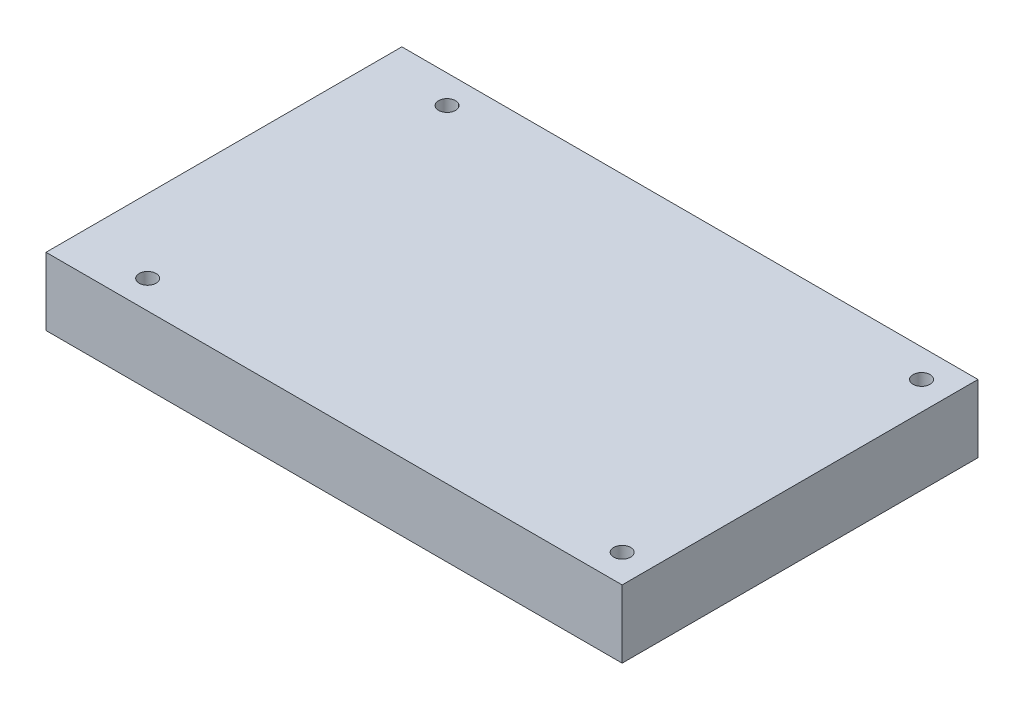
ISO-10303-21;
HEADER;
FILE_DESCRIPTION(('STEP AP214'),'2;1');
FILE_NAME('part.step','',(''),(''),'','','');
FILE_SCHEMA(('AUTOMOTIVE_DESIGN { 1 0 10303 214 1 1 1 1 }'));
ENDSEC;
DATA;
#1=APPLICATION_CONTEXT('core data for automotive mechanical design processes');
#2=APPLICATION_PROTOCOL_DEFINITION('international standard','automotive_design',2000,#1);
#3=PRODUCT_CONTEXT('',#1,'mechanical');
#4=PRODUCT('Part','Part','',(#3));
#5=PRODUCT_RELATED_PRODUCT_CATEGORY('part','',(#4));
#6=PRODUCT_DEFINITION_FORMATION('','',#4);
#7=PRODUCT_DEFINITION_CONTEXT('part definition',#1,'design');
#8=PRODUCT_DEFINITION('design','',#6,#7);
#9=PRODUCT_DEFINITION_SHAPE('','',#8);
#10=(LENGTH_UNIT() NAMED_UNIT(*) SI_UNIT(.MILLI.,.METRE.));
#11=(NAMED_UNIT(*) PLANE_ANGLE_UNIT() SI_UNIT($,.RADIAN.));
#12=(NAMED_UNIT(*) SI_UNIT($,.STERADIAN.) SOLID_ANGLE_UNIT());
#13=UNCERTAINTY_MEASURE_WITH_UNIT(LENGTH_MEASURE(1.E-05),#10,'distance_accuracy_value','');
#14=(GEOMETRIC_REPRESENTATION_CONTEXT(3) GLOBAL_UNCERTAINTY_ASSIGNED_CONTEXT((#13)) GLOBAL_UNIT_ASSIGNED_CONTEXT((#10,
#11,#12)) REPRESENTATION_CONTEXT('',''));
#15=CARTESIAN_POINT('',(0.,0.,0.));
#16=DIRECTION('',(0.,0.,1.));
#17=DIRECTION('',(1.,0.,0.));
#18=AXIS2_PLACEMENT_3D('',#15,#16,#17);
#19=CARTESIAN_POINT('',(-51.,12.,31.5));
#20=DIRECTION('',(1.,0.,0.));
#21=DIRECTION('',(0.,0.,-1.));
#22=AXIS2_PLACEMENT_3D('',#19,#20,#21);
#23=PLANE('',#22);
#24=DIRECTION('',(0.,0.,1.));
#25=VECTOR('',#24,1.);
#26=CARTESIAN_POINT('',(-51.,0.,31.5));
#27=LINE('',#26,#25);
#28=CARTESIAN_POINT('',(-51.,0.,-31.5));
#29=VERTEX_POINT('',#28);
#30=CARTESIAN_POINT('',(-51.,0.,31.5));
#31=VERTEX_POINT('',#30);
#32=EDGE_CURVE('E114',#29,#31,#27,.T.);
#33=ORIENTED_EDGE('',*,*,#32,.T.);
#34=DIRECTION('',(0.,-1.,0.));
#35=VECTOR('',#34,1.);
#36=CARTESIAN_POINT('',(-51.,12.,31.5));
#37=LINE('',#36,#35);
#38=CARTESIAN_POINT('',(-51.,12.,31.5));
#39=VERTEX_POINT('',#38);
#40=EDGE_CURVE('E11',#39,#31,#37,.T.);
#41=ORIENTED_EDGE('',*,*,#40,.F.);
#42=DIRECTION('',(0.,0.,1.));
#43=VECTOR('',#42,1.);
#44=CARTESIAN_POINT('',(-51.,12.,31.5));
#45=LINE('',#44,#43);
#46=CARTESIAN_POINT('',(-51.,12.,-31.5));
#47=VERTEX_POINT('',#46);
#48=EDGE_CURVE('E102',#47,#39,#45,.T.);
#49=ORIENTED_EDGE('',*,*,#48,.F.);
#50=DIRECTION('',(0.,-1.,0.));
#51=VECTOR('',#50,1.);
#52=CARTESIAN_POINT('',(-51.,12.,-31.5));
#53=LINE('',#52,#51);
#54=EDGE_CURVE('E110',#47,#29,#53,.T.);
#55=ORIENTED_EDGE('',*,*,#54,.T.);
#56=EDGE_LOOP('',(#33,#41,#49,#55));
#57=FACE_BOUND('',#56,.T.);
#58=ADVANCED_FACE('F51',(#57),#23,.F.);
#59=CARTESIAN_POINT('',(51.,12.,31.5));
#60=DIRECTION('',(0.,0.,-1.));
#61=DIRECTION('',(-1.,0.,0.));
#62=AXIS2_PLACEMENT_3D('',#59,#60,#61);
#63=PLANE('',#62);
#64=DIRECTION('',(1.,0.,0.));
#65=VECTOR('',#64,1.);
#66=CARTESIAN_POINT('',(51.,0.,31.5));
#67=LINE('',#66,#65);
#68=CARTESIAN_POINT('',(51.,0.,31.5));
#69=VERTEX_POINT('',#68);
#70=EDGE_CURVE('E106',#31,#69,#67,.T.);
#71=ORIENTED_EDGE('',*,*,#70,.T.);
#72=DIRECTION('',(0.,-1.,0.));
#73=VECTOR('',#72,1.);
#74=CARTESIAN_POINT('',(51.,12.,31.5));
#75=LINE('',#74,#73);
#76=CARTESIAN_POINT('',(51.,12.,31.5));
#77=VERTEX_POINT('',#76);
#78=EDGE_CURVE('E59',#77,#69,#75,.T.);
#79=ORIENTED_EDGE('',*,*,#78,.F.);
#80=DIRECTION('',(1.,0.,0.));
#81=VECTOR('',#80,1.);
#82=CARTESIAN_POINT('',(51.,12.,31.5));
#83=LINE('',#82,#81);
#84=EDGE_CURVE('E97',#39,#77,#83,.T.);
#85=ORIENTED_EDGE('',*,*,#84,.F.);
#86=ORIENTED_EDGE('',*,*,#40,.T.);
#87=EDGE_LOOP('',(#71,#79,#85,#86));
#88=FACE_BOUND('',#87,.T.);
#89=ADVANCED_FACE('F105',(#88),#63,.F.);
#90=CARTESIAN_POINT('',(51.,12.,31.5));
#91=DIRECTION('',(-1.,0.,0.));
#92=DIRECTION('',(0.,0.,1.));
#93=AXIS2_PLACEMENT_3D('',#90,#91,#92);
#94=PLANE('',#93);
#95=DIRECTION('',(0.,0.,-1.));
#96=VECTOR('',#95,1.);
#97=CARTESIAN_POINT('',(51.,0.,31.5));
#98=LINE('',#97,#96);
#99=CARTESIAN_POINT('',(51.,0.,-31.5));
#100=VERTEX_POINT('',#99);
#101=EDGE_CURVE('E84',#69,#100,#98,.T.);
#102=ORIENTED_EDGE('',*,*,#101,.T.);
#103=DIRECTION('',(0.,-1.,0.));
#104=VECTOR('',#103,1.);
#105=CARTESIAN_POINT('',(51.,12.,-31.5));
#106=LINE('',#105,#104);
#107=CARTESIAN_POINT('',(51.,12.,-31.5));
#108=VERTEX_POINT('',#107);
#109=EDGE_CURVE('E107',#108,#100,#106,.T.);
#110=ORIENTED_EDGE('',*,*,#109,.F.);
#111=DIRECTION('',(0.,0.,-1.));
#112=VECTOR('',#111,1.);
#113=CARTESIAN_POINT('',(51.,12.,31.5));
#114=LINE('',#113,#112);
#115=EDGE_CURVE('E100',#77,#108,#114,.T.);
#116=ORIENTED_EDGE('',*,*,#115,.F.);
#117=ORIENTED_EDGE('',*,*,#78,.T.);
#118=EDGE_LOOP('',(#102,#110,#116,#117));
#119=FACE_BOUND('',#118,.T.);
#120=ADVANCED_FACE('F108',(#119),#94,.F.);
#121=CARTESIAN_POINT('',(51.,12.,-31.5));
#122=DIRECTION('',(0.,0.,1.));
#123=DIRECTION('',(1.,0.,0.));
#124=AXIS2_PLACEMENT_3D('',#121,#122,#123);
#125=PLANE('',#124);
#126=DIRECTION('',(-1.,0.,0.));
#127=VECTOR('',#126,1.);
#128=CARTESIAN_POINT('',(51.,0.,-31.5));
#129=LINE('',#128,#127);
#130=EDGE_CURVE('E90',#100,#29,#129,.T.);
#131=ORIENTED_EDGE('',*,*,#130,.T.);
#132=ORIENTED_EDGE('',*,*,#54,.F.);
#133=DIRECTION('',(-1.,0.,0.));
#134=VECTOR('',#133,1.);
#135=CARTESIAN_POINT('',(51.,12.,-31.5));
#136=LINE('',#135,#134);
#137=EDGE_CURVE('E67',#108,#47,#136,.T.);
#138=ORIENTED_EDGE('',*,*,#137,.F.);
#139=ORIENTED_EDGE('',*,*,#109,.T.);
#140=EDGE_LOOP('',(#131,#132,#138,#139));
#141=FACE_BOUND('',#140,.T.);
#142=ADVANCED_FACE('F122',(#141),#125,.F.);
#143=CARTESIAN_POINT('',(0.,12.,0.));
#144=DIRECTION('',(0.,1.,0.));
#145=DIRECTION('',(0.,0.,1.));
#146=AXIS2_PLACEMENT_3D('',#143,#144,#145);
#147=PLANE('',#146);
#148=CARTESIAN_POINT('',(-37.9999999999994,12.,26.5));
#149=DIRECTION('',(0.,1.,0.));
#150=DIRECTION('',(0.,0.,1.));
#151=AXIS2_PLACEMENT_3D('',#148,#149,#150);
#152=CIRCLE('',#151,1.5);
#153=CARTESIAN_POINT('',(-37.9999999999994,12.,28.));
#154=VERTEX_POINT('',#153);
#155=EDGE_CURVE('E137',#154,#154,#152,.T.);
#156=ORIENTED_EDGE('',*,*,#155,.F.);
#157=EDGE_LOOP('',(#156));
#158=FACE_BOUND('',#157,.T.);
#159=CARTESIAN_POINT('',(46.0000000000006,12.,26.5));
#160=DIRECTION('',(0.,1.,0.));
#161=DIRECTION('',(0.,0.,1.));
#162=AXIS2_PLACEMENT_3D('',#159,#160,#161);
#163=CIRCLE('',#162,1.5);
#164=CARTESIAN_POINT('',(46.0000000000006,12.,28.));
#165=VERTEX_POINT('',#164);
#166=EDGE_CURVE('E143',#165,#165,#163,.T.);
#167=ORIENTED_EDGE('',*,*,#166,.F.);
#168=EDGE_LOOP('',(#167));
#169=FACE_BOUND('',#168,.T.);
#170=CARTESIAN_POINT('',(46.,12.,-26.5));
#171=DIRECTION('',(0.,1.,0.));
#172=DIRECTION('',(0.,0.,1.));
#173=AXIS2_PLACEMENT_3D('',#170,#171,#172);
#174=CIRCLE('',#173,1.5);
#175=CARTESIAN_POINT('',(46.,12.,-25.));
#176=VERTEX_POINT('',#175);
#177=EDGE_CURVE('E131',#176,#176,#174,.T.);
#178=ORIENTED_EDGE('',*,*,#177,.F.);
#179=EDGE_LOOP('',(#178));
#180=FACE_BOUND('',#179,.T.);
#181=CARTESIAN_POINT('',(-38.,12.,-26.5));
#182=DIRECTION('',(0.,1.,0.));
#183=DIRECTION('',(0.,0.,1.));
#184=AXIS2_PLACEMENT_3D('',#181,#182,#183);
#185=CIRCLE('',#184,1.5);
#186=CARTESIAN_POINT('',(-38.,12.,-25.));
#187=VERTEX_POINT('',#186);
#188=EDGE_CURVE('E128',#187,#187,#185,.T.);
#189=ORIENTED_EDGE('',*,*,#188,.F.);
#190=EDGE_LOOP('',(#189));
#191=FACE_BOUND('',#190,.T.);
#192=ORIENTED_EDGE('',*,*,#48,.T.);
#193=ORIENTED_EDGE('',*,*,#84,.T.);
#194=ORIENTED_EDGE('',*,*,#115,.T.);
#195=ORIENTED_EDGE('',*,*,#137,.T.);
#196=EDGE_LOOP('',(#192,#193,#194,#195));
#197=FACE_BOUND('',#196,.T.);
#198=ADVANCED_FACE('F98',(#158,#169,#180,#191,#197),#147,.T.);
#199=CARTESIAN_POINT('',(0.,0.,0.));
#200=DIRECTION('',(0.,1.,0.));
#201=DIRECTION('',(0.,0.,1.));
#202=AXIS2_PLACEMENT_3D('',#199,#200,#201);
#203=PLANE('',#202);
#204=CARTESIAN_POINT('',(-37.9999999999994,0.,26.5));
#205=DIRECTION('',(0.,1.,0.));
#206=DIRECTION('',(0.,0.,1.));
#207=AXIS2_PLACEMENT_3D('',#204,#205,#206);
#208=CIRCLE('',#207,1.5);
#209=CARTESIAN_POINT('',(-37.9999999999994,0.,28.));
#210=VERTEX_POINT('',#209);
#211=EDGE_CURVE('E134',#210,#210,#208,.T.);
#212=ORIENTED_EDGE('',*,*,#211,.T.);
#213=EDGE_LOOP('',(#212));
#214=FACE_BOUND('',#213,.T.);
#215=CARTESIAN_POINT('',(46.0000000000006,0.,26.5));
#216=DIRECTION('',(0.,1.,0.));
#217=DIRECTION('',(0.,0.,1.));
#218=AXIS2_PLACEMENT_3D('',#215,#216,#217);
#219=CIRCLE('',#218,1.5);
#220=CARTESIAN_POINT('',(46.0000000000006,0.,28.));
#221=VERTEX_POINT('',#220);
#222=EDGE_CURVE('E140',#221,#221,#219,.T.);
#223=ORIENTED_EDGE('',*,*,#222,.T.);
#224=EDGE_LOOP('',(#223));
#225=FACE_BOUND('',#224,.T.);
#226=CARTESIAN_POINT('',(46.,0.,-26.5));
#227=DIRECTION('',(0.,1.,0.));
#228=DIRECTION('',(0.,0.,1.));
#229=AXIS2_PLACEMENT_3D('',#226,#227,#228);
#230=CIRCLE('',#229,1.5);
#231=CARTESIAN_POINT('',(46.,0.,-25.));
#232=VERTEX_POINT('',#231);
#233=EDGE_CURVE('E146',#232,#232,#230,.T.);
#234=ORIENTED_EDGE('',*,*,#233,.T.);
#235=EDGE_LOOP('',(#234));
#236=FACE_BOUND('',#235,.T.);
#237=CARTESIAN_POINT('',(-38.,0.,-26.5));
#238=DIRECTION('',(0.,1.,0.));
#239=DIRECTION('',(0.,0.,1.));
#240=AXIS2_PLACEMENT_3D('',#237,#238,#239);
#241=CIRCLE('',#240,1.5);
#242=CARTESIAN_POINT('',(-38.,0.,-25.));
#243=VERTEX_POINT('',#242);
#244=EDGE_CURVE('E117',#243,#243,#241,.T.);
#245=ORIENTED_EDGE('',*,*,#244,.T.);
#246=EDGE_LOOP('',(#245));
#247=FACE_BOUND('',#246,.T.);
#248=ORIENTED_EDGE('',*,*,#32,.F.);
#249=ORIENTED_EDGE('',*,*,#130,.F.);
#250=ORIENTED_EDGE('',*,*,#101,.F.);
#251=ORIENTED_EDGE('',*,*,#70,.F.);
#252=EDGE_LOOP('',(#248,#249,#250,#251));
#253=FACE_BOUND('',#252,.T.);
#254=ADVANCED_FACE('F125',(#214,#225,#236,#247,#253),#203,.F.);
#255=CARTESIAN_POINT('',(-38.,0.,-26.5));
#256=DIRECTION('',(0.,1.,0.));
#257=DIRECTION('',(0.,0.,1.));
#258=AXIS2_PLACEMENT_3D('',#255,#256,#257);
#259=CYLINDRICAL_SURFACE('',#258,1.5);
#260=ORIENTED_EDGE('',*,*,#244,.F.);
#261=EDGE_LOOP('',(#260));
#262=FACE_BOUND('',#261,.T.);
#263=ORIENTED_EDGE('',*,*,#188,.T.);
#264=EDGE_LOOP('',(#263));
#265=FACE_BOUND('',#264,.T.);
#266=ADVANCED_FACE('F160',(#262,#265),#259,.F.);
#267=CARTESIAN_POINT('',(46.,0.,-26.5));
#268=DIRECTION('',(0.,1.,0.));
#269=DIRECTION('',(0.,0.,1.));
#270=AXIS2_PLACEMENT_3D('',#267,#268,#269);
#271=CYLINDRICAL_SURFACE('',#270,1.5);
#272=ORIENTED_EDGE('',*,*,#233,.F.);
#273=EDGE_LOOP('',(#272));
#274=FACE_BOUND('',#273,.T.);
#275=ORIENTED_EDGE('',*,*,#177,.T.);
#276=EDGE_LOOP('',(#275));
#277=FACE_BOUND('',#276,.T.);
#278=ADVANCED_FACE('F152',(#274,#277),#271,.F.);
#279=CARTESIAN_POINT('',(46.0000000000006,0.,26.5));
#280=DIRECTION('',(0.,1.,0.));
#281=DIRECTION('',(0.,0.,1.));
#282=AXIS2_PLACEMENT_3D('',#279,#280,#281);
#283=CYLINDRICAL_SURFACE('',#282,1.5);
#284=ORIENTED_EDGE('',*,*,#222,.F.);
#285=EDGE_LOOP('',(#284));
#286=FACE_BOUND('',#285,.T.);
#287=ORIENTED_EDGE('',*,*,#166,.T.);
#288=EDGE_LOOP('',(#287));
#289=FACE_BOUND('',#288,.T.);
#290=ADVANCED_FACE('F168',(#286,#289),#283,.F.);
#291=CARTESIAN_POINT('',(-37.9999999999994,0.,26.5));
#292=DIRECTION('',(0.,1.,0.));
#293=DIRECTION('',(0.,0.,1.));
#294=AXIS2_PLACEMENT_3D('',#291,#292,#293);
#295=CYLINDRICAL_SURFACE('',#294,1.5);
#296=ORIENTED_EDGE('',*,*,#211,.F.);
#297=EDGE_LOOP('',(#296));
#298=FACE_BOUND('',#297,.T.);
#299=ORIENTED_EDGE('',*,*,#155,.T.);
#300=EDGE_LOOP('',(#299));
#301=FACE_BOUND('',#300,.T.);
#302=ADVANCED_FACE('F265',(#298,#301),#295,.F.);
#303=CLOSED_SHELL('',(#58,#89,#120,#142,#198,#254,#266,#278,#290,#302));
#304=MANIFOLD_SOLID_BREP('B2',#303);
#305=ADVANCED_BREP_SHAPE_REPRESENTATION('',(#18,#304),#14);
#306=SHAPE_DEFINITION_REPRESENTATION(#9,#305);
ENDSEC;
END-ISO-10303-21;
